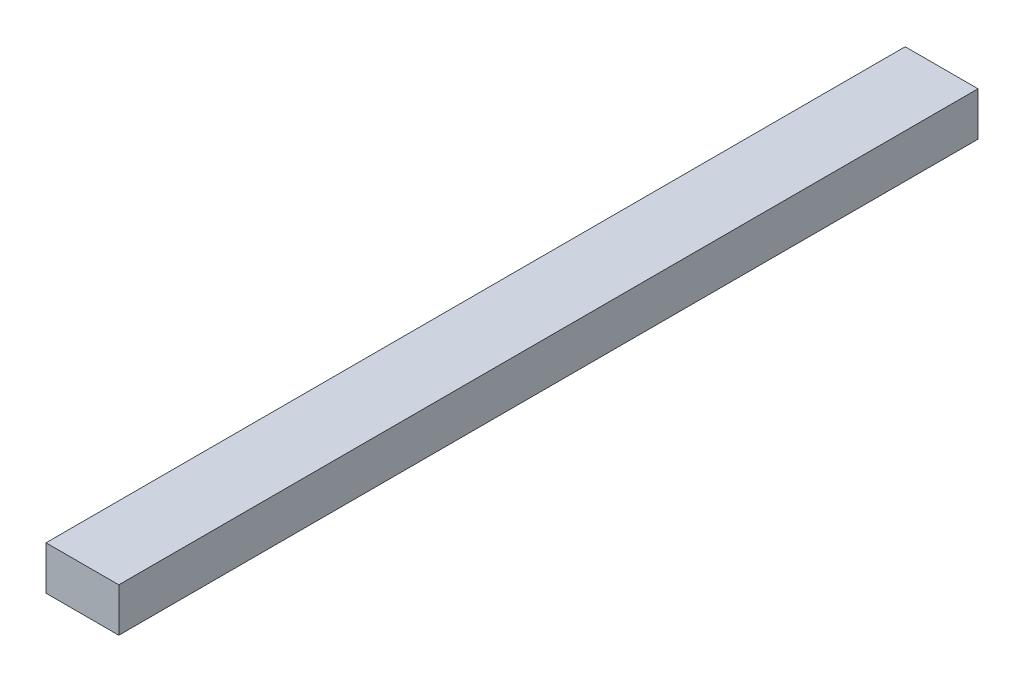
ISO-10303-21;
HEADER;
FILE_DESCRIPTION(('STEP AP214'),'2;1');
FILE_NAME('part.step','',(''),(''),'','','');
FILE_SCHEMA(('AUTOMOTIVE_DESIGN { 1 0 10303 214 1 1 1 1 }'));
ENDSEC;
DATA;
#1=APPLICATION_CONTEXT('core data for automotive mechanical design processes');
#2=APPLICATION_PROTOCOL_DEFINITION('international standard','automotive_design',2000,#1);
#3=PRODUCT_CONTEXT('',#1,'mechanical');
#4=PRODUCT('Part','Part','',(#3));
#5=PRODUCT_RELATED_PRODUCT_CATEGORY('part','',(#4));
#6=PRODUCT_DEFINITION_FORMATION('','',#4);
#7=PRODUCT_DEFINITION_CONTEXT('part definition',#1,'design');
#8=PRODUCT_DEFINITION('design','',#6,#7);
#9=PRODUCT_DEFINITION_SHAPE('','',#8);
#10=(LENGTH_UNIT() NAMED_UNIT(*) SI_UNIT(.MILLI.,.METRE.));
#11=(NAMED_UNIT(*) PLANE_ANGLE_UNIT() SI_UNIT($,.RADIAN.));
#12=(NAMED_UNIT(*) SI_UNIT($,.STERADIAN.) SOLID_ANGLE_UNIT());
#13=UNCERTAINTY_MEASURE_WITH_UNIT(LENGTH_MEASURE(1.E-05),#10,'distance_accuracy_value','');
#14=(GEOMETRIC_REPRESENTATION_CONTEXT(3) GLOBAL_UNCERTAINTY_ASSIGNED_CONTEXT((#13)) GLOBAL_UNIT_ASSIGNED_CONTEXT((#10,
#11,#12)) REPRESENTATION_CONTEXT('',''));
#15=CARTESIAN_POINT('',(0.,0.,0.));
#16=DIRECTION('',(0.,0.,1.));
#17=DIRECTION('',(1.,0.,0.));
#18=AXIS2_PLACEMENT_3D('',#15,#16,#17);
#19=CARTESIAN_POINT('',(-50.,30.,590.));
#20=DIRECTION('',(1.,0.,0.));
#21=DIRECTION('',(0.,1.,0.));
#22=AXIS2_PLACEMENT_3D('',#19,#20,#21);
#23=PLANE('',#22);
#24=DIRECTION('',(0.,-1.,0.));
#25=VECTOR('',#24,1.);
#26=CARTESIAN_POINT('',(-50.,30.,-590.));
#27=LINE('',#26,#25);
#28=CARTESIAN_POINT('',(-50.,30.,-590.));
#29=VERTEX_POINT('',#28);
#30=CARTESIAN_POINT('',(-50.,-30.,-590.));
#31=VERTEX_POINT('',#30);
#32=EDGE_CURVE('E98',#29,#31,#27,.T.);
#33=ORIENTED_EDGE('',*,*,#32,.T.);
#34=DIRECTION('',(0.,0.,-1.));
#35=VECTOR('',#34,1.);
#36=CARTESIAN_POINT('',(-50.,-30.,590.));
#37=LINE('',#36,#35);
#38=CARTESIAN_POINT('',(-50.,-30.,590.));
#39=VERTEX_POINT('',#38);
#40=EDGE_CURVE('E11',#39,#31,#37,.T.);
#41=ORIENTED_EDGE('',*,*,#40,.F.);
#42=DIRECTION('',(0.,-1.,0.));
#43=VECTOR('',#42,1.);
#44=CARTESIAN_POINT('',(-50.,30.,590.));
#45=LINE('',#44,#43);
#46=CARTESIAN_POINT('',(-50.,30.,590.));
#47=VERTEX_POINT('',#46);
#48=EDGE_CURVE('E86',#47,#39,#45,.T.);
#49=ORIENTED_EDGE('',*,*,#48,.F.);
#50=DIRECTION('',(0.,0.,-1.));
#51=VECTOR('',#50,1.);
#52=CARTESIAN_POINT('',(-50.,30.,590.));
#53=LINE('',#52,#51);
#54=EDGE_CURVE('E94',#47,#29,#53,.T.);
#55=ORIENTED_EDGE('',*,*,#54,.T.);
#56=EDGE_LOOP('',(#33,#41,#49,#55));
#57=FACE_BOUND('',#56,.T.);
#58=ADVANCED_FACE('F35',(#57),#23,.F.);
#59=CARTESIAN_POINT('',(50.,-30.,590.));
#60=DIRECTION('',(0.,1.,0.));
#61=DIRECTION('',(-1.,0.,0.));
#62=AXIS2_PLACEMENT_3D('',#59,#60,#61);
#63=PLANE('',#62);
#64=DIRECTION('',(1.,0.,0.));
#65=VECTOR('',#64,1.);
#66=CARTESIAN_POINT('',(50.,-30.,-590.));
#67=LINE('',#66,#65);
#68=CARTESIAN_POINT('',(50.,-30.,-590.));
#69=VERTEX_POINT('',#68);
#70=EDGE_CURVE('E90',#31,#69,#67,.T.);
#71=ORIENTED_EDGE('',*,*,#70,.T.);
#72=DIRECTION('',(0.,0.,-1.));
#73=VECTOR('',#72,1.);
#74=CARTESIAN_POINT('',(50.,-30.,590.));
#75=LINE('',#74,#73);
#76=CARTESIAN_POINT('',(50.,-30.,590.));
#77=VERTEX_POINT('',#76);
#78=EDGE_CURVE('E43',#77,#69,#75,.T.);
#79=ORIENTED_EDGE('',*,*,#78,.F.);
#80=DIRECTION('',(1.,0.,0.));
#81=VECTOR('',#80,1.);
#82=CARTESIAN_POINT('',(50.,-30.,590.));
#83=LINE('',#82,#81);
#84=EDGE_CURVE('E81',#39,#77,#83,.T.);
#85=ORIENTED_EDGE('',*,*,#84,.F.);
#86=ORIENTED_EDGE('',*,*,#40,.T.);
#87=EDGE_LOOP('',(#71,#79,#85,#86));
#88=FACE_BOUND('',#87,.T.);
#89=ADVANCED_FACE('F89',(#88),#63,.F.);
#90=CARTESIAN_POINT('',(50.,30.,590.));
#91=DIRECTION('',(-1.,0.,0.));
#92=DIRECTION('',(0.,-1.,0.));
#93=AXIS2_PLACEMENT_3D('',#90,#91,#92);
#94=PLANE('',#93);
#95=DIRECTION('',(0.,1.,0.));
#96=VECTOR('',#95,1.);
#97=CARTESIAN_POINT('',(50.,30.,-590.));
#98=LINE('',#97,#96);
#99=CARTESIAN_POINT('',(50.,30.,-590.));
#100=VERTEX_POINT('',#99);
#101=EDGE_CURVE('E68',#69,#100,#98,.T.);
#102=ORIENTED_EDGE('',*,*,#101,.T.);
#103=DIRECTION('',(0.,0.,-1.));
#104=VECTOR('',#103,1.);
#105=CARTESIAN_POINT('',(50.,30.,590.));
#106=LINE('',#105,#104);
#107=CARTESIAN_POINT('',(50.,30.,590.));
#108=VERTEX_POINT('',#107);
#109=EDGE_CURVE('E91',#108,#100,#106,.T.);
#110=ORIENTED_EDGE('',*,*,#109,.F.);
#111=DIRECTION('',(0.,1.,0.));
#112=VECTOR('',#111,1.);
#113=CARTESIAN_POINT('',(50.,30.,590.));
#114=LINE('',#113,#112);
#115=EDGE_CURVE('E84',#77,#108,#114,.T.);
#116=ORIENTED_EDGE('',*,*,#115,.F.);
#117=ORIENTED_EDGE('',*,*,#78,.T.);
#118=EDGE_LOOP('',(#102,#110,#116,#117));
#119=FACE_BOUND('',#118,.T.);
#120=ADVANCED_FACE('F92',(#119),#94,.F.);
#121=CARTESIAN_POINT('',(50.,30.,590.));
#122=DIRECTION('',(0.,-1.,0.));
#123=DIRECTION('',(1.,0.,0.));
#124=AXIS2_PLACEMENT_3D('',#121,#122,#123);
#125=PLANE('',#124);
#126=DIRECTION('',(-1.,0.,0.));
#127=VECTOR('',#126,1.);
#128=CARTESIAN_POINT('',(50.,30.,-590.));
#129=LINE('',#128,#127);
#130=EDGE_CURVE('E74',#100,#29,#129,.T.);
#131=ORIENTED_EDGE('',*,*,#130,.T.);
#132=ORIENTED_EDGE('',*,*,#54,.F.);
#133=DIRECTION('',(-1.,0.,0.));
#134=VECTOR('',#133,1.);
#135=CARTESIAN_POINT('',(50.,30.,590.));
#136=LINE('',#135,#134);
#137=EDGE_CURVE('E51',#108,#47,#136,.T.);
#138=ORIENTED_EDGE('',*,*,#137,.F.);
#139=ORIENTED_EDGE('',*,*,#109,.T.);
#140=EDGE_LOOP('',(#131,#132,#138,#139));
#141=FACE_BOUND('',#140,.T.);
#142=ADVANCED_FACE('F105',(#141),#125,.F.);
#143=CARTESIAN_POINT('',(0.,0.,590.));
#144=DIRECTION('',(0.,0.,-1.));
#145=DIRECTION('',(-1.,0.,0.));
#146=AXIS2_PLACEMENT_3D('',#143,#144,#145);
#147=PLANE('',#146);
#148=ORIENTED_EDGE('',*,*,#48,.T.);
#149=ORIENTED_EDGE('',*,*,#84,.T.);
#150=ORIENTED_EDGE('',*,*,#115,.T.);
#151=ORIENTED_EDGE('',*,*,#137,.T.);
#152=EDGE_LOOP('',(#148,#149,#150,#151));
#153=FACE_BOUND('',#152,.T.);
#154=ADVANCED_FACE('F82',(#153),#147,.F.);
#155=CARTESIAN_POINT('',(0.,0.,-590.));
#156=DIRECTION('',(0.,0.,-1.));
#157=DIRECTION('',(-1.,0.,0.));
#158=AXIS2_PLACEMENT_3D('',#155,#156,#157);
#159=PLANE('',#158);
#160=ORIENTED_EDGE('',*,*,#32,.F.);
#161=ORIENTED_EDGE('',*,*,#130,.F.);
#162=ORIENTED_EDGE('',*,*,#101,.F.);
#163=ORIENTED_EDGE('',*,*,#70,.F.);
#164=EDGE_LOOP('',(#160,#161,#162,#163));
#165=FACE_BOUND('',#164,.T.);
#166=ADVANCED_FACE('F108',(#165),#159,.T.);
#167=CLOSED_SHELL('',(#58,#89,#120,#142,#154,#166));
#168=MANIFOLD_SOLID_BREP('B2',#167);
#169=ADVANCED_BREP_SHAPE_REPRESENTATION('',(#18,#168),#14);
#170=SHAPE_DEFINITION_REPRESENTATION(#9,#169);
ENDSEC;
END-ISO-10303-21;
